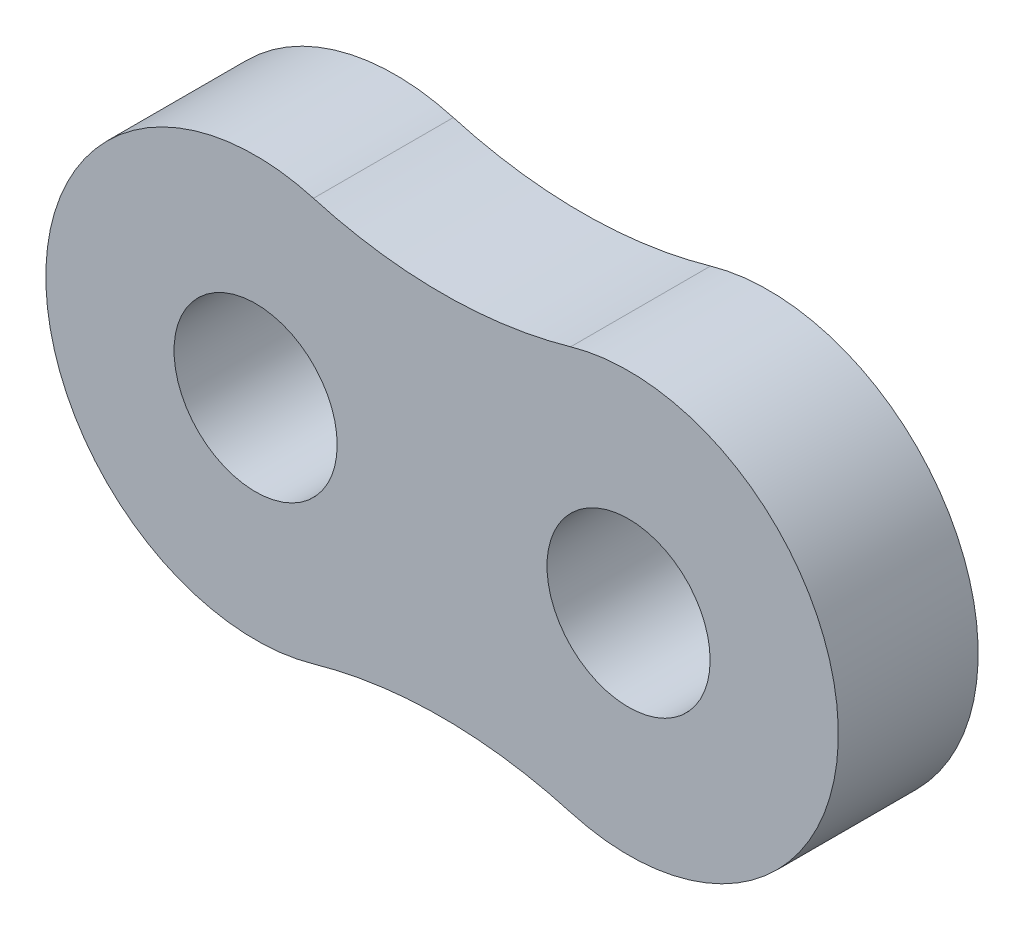
ISO-10303-21;
HEADER;
FILE_DESCRIPTION(('STEP AP214'),'2;1');
FILE_NAME('part.step','',(''),(''),'','','');
FILE_SCHEMA(('AUTOMOTIVE_DESIGN { 1 0 10303 214 1 1 1 1 }'));
ENDSEC;
DATA;
#1=APPLICATION_CONTEXT('core data for automotive mechanical design processes');
#2=APPLICATION_PROTOCOL_DEFINITION('international standard','automotive_design',2000,#1);
#3=PRODUCT_CONTEXT('',#1,'mechanical');
#4=PRODUCT('Part','Part','',(#3));
#5=PRODUCT_RELATED_PRODUCT_CATEGORY('part','',(#4));
#6=PRODUCT_DEFINITION_FORMATION('','',#4);
#7=PRODUCT_DEFINITION_CONTEXT('part definition',#1,'design');
#8=PRODUCT_DEFINITION('design','',#6,#7);
#9=PRODUCT_DEFINITION_SHAPE('','',#8);
#10=(LENGTH_UNIT() NAMED_UNIT(*) SI_UNIT(.MILLI.,.METRE.));
#11=(NAMED_UNIT(*) PLANE_ANGLE_UNIT() SI_UNIT($,.RADIAN.));
#12=(NAMED_UNIT(*) SI_UNIT($,.STERADIAN.) SOLID_ANGLE_UNIT());
#13=UNCERTAINTY_MEASURE_WITH_UNIT(LENGTH_MEASURE(1.E-05),#10,'distance_accuracy_value','');
#14=(GEOMETRIC_REPRESENTATION_CONTEXT(3) GLOBAL_UNCERTAINTY_ASSIGNED_CONTEXT((#13)) GLOBAL_UNIT_ASSIGNED_CONTEXT((#10,
#11,#12)) REPRESENTATION_CONTEXT('',''));
#15=CARTESIAN_POINT('',(0.,0.,0.));
#16=DIRECTION('',(0.,0.,1.));
#17=DIRECTION('',(1.,0.,0.));
#18=AXIS2_PLACEMENT_3D('',#15,#16,#17);
#19=CARTESIAN_POINT('',(0.,0.,3.));
#20=DIRECTION('',(0.,0.,-1.));
#21=DIRECTION('',(-1.,0.,0.));
#22=AXIS2_PLACEMENT_3D('',#19,#20,#21);
#23=CYLINDRICAL_SURFACE('',#22,4.5);
#24=CARTESIAN_POINT('',(0.,0.,0.));
#25=DIRECTION('',(0.,0.,1.));
#26=DIRECTION('',(1.,0.,0.));
#27=AXIS2_PLACEMENT_3D('',#24,#25,#26);
#28=CIRCLE('',#27,4.5);
#29=CARTESIAN_POINT('',(1.24137931034483,4.32538754423783,0.));
#30=VERTEX_POINT('',#29);
#31=CARTESIAN_POINT('',(1.24137931034483,-4.32538754423783,0.));
#32=VERTEX_POINT('',#31);
#33=EDGE_CURVE('E100',#30,#32,#28,.T.);
#34=ORIENTED_EDGE('',*,*,#33,.T.);
#35=DIRECTION('',(0.,0.,-1.));
#36=VECTOR('',#35,1.);
#37=CARTESIAN_POINT('',(1.24137931034483,-4.32538754423783,3.));
#38=LINE('',#37,#36);
#39=CARTESIAN_POINT('',(1.24137931034483,-4.32538754423783,3.));
#40=VERTEX_POINT('',#39);
#41=EDGE_CURVE('E52',#32,#40,#38,.F.);
#42=ORIENTED_EDGE('',*,*,#41,.T.);
#43=CARTESIAN_POINT('',(0.,0.,3.));
#44=DIRECTION('',(0.,0.,1.));
#45=DIRECTION('',(1.,0.,0.));
#46=AXIS2_PLACEMENT_3D('',#43,#44,#45);
#47=CIRCLE('',#46,4.5);
#48=CARTESIAN_POINT('',(1.24137931034483,4.32538754423783,3.));
#49=VERTEX_POINT('',#48);
#50=EDGE_CURVE('E116',#49,#40,#47,.T.);
#51=ORIENTED_EDGE('',*,*,#50,.F.);
#52=DIRECTION('',(0.,0.,-1.));
#53=VECTOR('',#52,1.);
#54=CARTESIAN_POINT('',(1.24137931034483,4.32538754423783,3.));
#55=LINE('',#54,#53);
#56=EDGE_CURVE('E94',#49,#30,#55,.T.);
#57=ORIENTED_EDGE('',*,*,#56,.T.);
#58=EDGE_LOOP('',(#34,#42,#51,#57));
#59=FACE_BOUND('',#58,.T.);
#60=ADVANCED_FACE('F37',(#59),#23,.T.);
#61=CARTESIAN_POINT('',(8.,0.,3.));
#62=DIRECTION('',(0.,0.,-1.));
#63=DIRECTION('',(-1.,0.,0.));
#64=AXIS2_PLACEMENT_3D('',#61,#62,#63);
#65=CYLINDRICAL_SURFACE('',#64,4.5);
#66=CARTESIAN_POINT('',(8.,0.,3.));
#67=DIRECTION('',(0.,0.,1.));
#68=DIRECTION('',(1.,0.,0.));
#69=AXIS2_PLACEMENT_3D('',#66,#67,#68);
#70=CIRCLE('',#69,4.5);
#71=CARTESIAN_POINT('',(6.75862068965517,-4.32538754423784,3.));
#72=VERTEX_POINT('',#71);
#73=CARTESIAN_POINT('',(6.75862068965517,4.32538754423784,3.));
#74=VERTEX_POINT('',#73);
#75=EDGE_CURVE('E93',#72,#74,#70,.T.);
#76=ORIENTED_EDGE('',*,*,#75,.F.);
#77=DIRECTION('',(0.,0.,-1.));
#78=VECTOR('',#77,1.);
#79=CARTESIAN_POINT('',(6.75862068965517,-4.32538754423783,3.));
#80=LINE('',#79,#78);
#81=CARTESIAN_POINT('',(6.75862068965517,-4.32538754423784,0.));
#82=VERTEX_POINT('',#81);
#83=EDGE_CURVE('E81',#72,#82,#80,.T.);
#84=ORIENTED_EDGE('',*,*,#83,.T.);
#85=CARTESIAN_POINT('',(8.,0.,0.));
#86=DIRECTION('',(0.,0.,1.));
#87=DIRECTION('',(1.,0.,0.));
#88=AXIS2_PLACEMENT_3D('',#85,#86,#87);
#89=CIRCLE('',#88,4.5);
#90=CARTESIAN_POINT('',(6.75862068965517,4.32538754423784,0.));
#91=VERTEX_POINT('',#90);
#92=EDGE_CURVE('E91',#82,#91,#89,.T.);
#93=ORIENTED_EDGE('',*,*,#92,.T.);
#94=DIRECTION('',(0.,0.,-1.));
#95=VECTOR('',#94,1.);
#96=CARTESIAN_POINT('',(6.75862068965517,4.32538754423784,3.));
#97=LINE('',#96,#95);
#98=EDGE_CURVE('E95',#91,#74,#97,.F.);
#99=ORIENTED_EDGE('',*,*,#98,.T.);
#100=EDGE_LOOP('',(#76,#84,#93,#99));
#101=FACE_BOUND('',#100,.T.);
#102=ADVANCED_FACE('F90',(#101),#65,.T.);
#103=CARTESIAN_POINT('',(8.,0.,3.));
#104=DIRECTION('',(0.,0.,-1.));
#105=DIRECTION('',(-1.,0.,0.));
#106=AXIS2_PLACEMENT_3D('',#103,#104,#105);
#107=CYLINDRICAL_SURFACE('',#106,1.75);
#108=CARTESIAN_POINT('',(8.,0.,3.));
#109=DIRECTION('',(0.,0.,1.));
#110=DIRECTION('',(1.,0.,0.));
#111=AXIS2_PLACEMENT_3D('',#108,#109,#110);
#112=CIRCLE('',#111,1.75);
#113=CARTESIAN_POINT('',(9.75,0.,3.));
#114=VERTEX_POINT('',#113);
#115=EDGE_CURVE('E103',#114,#114,#112,.T.);
#116=ORIENTED_EDGE('',*,*,#115,.T.);
#117=EDGE_LOOP('',(#116));
#118=FACE_BOUND('',#117,.T.);
#119=CARTESIAN_POINT('',(8.,0.,0.));
#120=DIRECTION('',(0.,0.,1.));
#121=DIRECTION('',(1.,0.,0.));
#122=AXIS2_PLACEMENT_3D('',#119,#120,#121);
#123=CIRCLE('',#122,1.75);
#124=CARTESIAN_POINT('',(9.75,0.,0.));
#125=VERTEX_POINT('',#124);
#126=EDGE_CURVE('E105',#125,#125,#123,.T.);
#127=ORIENTED_EDGE('',*,*,#126,.F.);
#128=EDGE_LOOP('',(#127));
#129=FACE_BOUND('',#128,.T.);
#130=ADVANCED_FACE('F128',(#118,#129),#107,.F.);
#131=CARTESIAN_POINT('',(0.,0.,3.));
#132=DIRECTION('',(0.,0.,-1.));
#133=DIRECTION('',(-1.,0.,0.));
#134=AXIS2_PLACEMENT_3D('',#131,#132,#133);
#135=CYLINDRICAL_SURFACE('',#134,1.75);
#136=CARTESIAN_POINT('',(0.,0.,3.));
#137=DIRECTION('',(0.,0.,1.));
#138=DIRECTION('',(1.,0.,0.));
#139=AXIS2_PLACEMENT_3D('',#136,#137,#138);
#140=CIRCLE('',#139,1.75);
#141=CARTESIAN_POINT('',(1.75,0.,3.));
#142=VERTEX_POINT('',#141);
#143=EDGE_CURVE('E109',#142,#142,#140,.T.);
#144=ORIENTED_EDGE('',*,*,#143,.T.);
#145=EDGE_LOOP('',(#144));
#146=FACE_BOUND('',#145,.T.);
#147=CARTESIAN_POINT('',(0.,0.,0.));
#148=DIRECTION('',(0.,0.,1.));
#149=DIRECTION('',(1.,0.,0.));
#150=AXIS2_PLACEMENT_3D('',#147,#148,#149);
#151=CIRCLE('',#150,1.75);
#152=CARTESIAN_POINT('',(1.75,0.,0.));
#153=VERTEX_POINT('',#152);
#154=EDGE_CURVE('E99',#153,#153,#151,.T.);
#155=ORIENTED_EDGE('',*,*,#154,.F.);
#156=EDGE_LOOP('',(#155));
#157=FACE_BOUND('',#156,.T.);
#158=ADVANCED_FACE('F130',(#146,#157),#135,.F.);
#159=CARTESIAN_POINT('',(0.,0.,3.));
#160=DIRECTION('',(0.,0.,1.));
#161=DIRECTION('',(1.,0.,0.));
#162=AXIS2_PLACEMENT_3D('',#159,#160,#161);
#163=PLANE('',#162);
#164=ORIENTED_EDGE('',*,*,#115,.F.);
#165=EDGE_LOOP('',(#164));
#166=FACE_BOUND('',#165,.T.);
#167=ORIENTED_EDGE('',*,*,#75,.T.);
#168=CARTESIAN_POINT('',(3.99999999999999,13.9373598647664,3.));
#169=DIRECTION('',(0.,0.,1.));
#170=DIRECTION('',(1.,0.,0.));
#171=AXIS2_PLACEMENT_3D('',#168,#169,#170);
#172=CIRCLE('',#171,10.);
#173=EDGE_CURVE('E11',#74,#49,#172,.F.);
#174=ORIENTED_EDGE('',*,*,#173,.T.);
#175=ORIENTED_EDGE('',*,*,#50,.T.);
#176=CARTESIAN_POINT('',(3.99999999999999,-13.9373598647664,3.));
#177=DIRECTION('',(0.,0.,1.));
#178=DIRECTION('',(1.,0.,0.));
#179=AXIS2_PLACEMENT_3D('',#176,#177,#178);
#180=CIRCLE('',#179,10.);
#181=EDGE_CURVE('E85',#40,#72,#180,.F.);
#182=ORIENTED_EDGE('',*,*,#181,.T.);
#183=EDGE_LOOP('',(#167,#174,#175,#182));
#184=FACE_BOUND('',#183,.T.);
#185=ORIENTED_EDGE('',*,*,#143,.F.);
#186=EDGE_LOOP('',(#185));
#187=FACE_BOUND('',#186,.T.);
#188=ADVANCED_FACE('F114',(#166,#184,#187),#163,.T.);
#189=CARTESIAN_POINT('',(0.,0.,0.));
#190=DIRECTION('',(0.,0.,1.));
#191=DIRECTION('',(1.,0.,0.));
#192=AXIS2_PLACEMENT_3D('',#189,#190,#191);
#193=PLANE('',#192);
#194=ORIENTED_EDGE('',*,*,#126,.T.);
#195=EDGE_LOOP('',(#194));
#196=FACE_BOUND('',#195,.T.);
#197=ORIENTED_EDGE('',*,*,#33,.F.);
#198=CARTESIAN_POINT('',(3.99999999999999,13.9373598647664,0.));
#199=DIRECTION('',(0.,0.,1.));
#200=DIRECTION('',(1.,0.,0.));
#201=AXIS2_PLACEMENT_3D('',#198,#199,#200);
#202=CIRCLE('',#201,10.);
#203=EDGE_CURVE('E45',#30,#91,#202,.T.);
#204=ORIENTED_EDGE('',*,*,#203,.T.);
#205=ORIENTED_EDGE('',*,*,#92,.F.);
#206=CARTESIAN_POINT('',(3.99999999999999,-13.9373598647664,0.));
#207=DIRECTION('',(0.,0.,1.));
#208=DIRECTION('',(1.,0.,0.));
#209=AXIS2_PLACEMENT_3D('',#206,#207,#208);
#210=CIRCLE('',#209,10.);
#211=EDGE_CURVE('E77',#82,#32,#210,.T.);
#212=ORIENTED_EDGE('',*,*,#211,.T.);
#213=EDGE_LOOP('',(#197,#204,#205,#212));
#214=FACE_BOUND('',#213,.T.);
#215=ORIENTED_EDGE('',*,*,#154,.T.);
#216=EDGE_LOOP('',(#215));
#217=FACE_BOUND('',#216,.T.);
#218=ADVANCED_FACE('F97',(#196,#214,#217),#193,.F.);
#219=CARTESIAN_POINT('',(3.99999999999999,-13.9373598647664,3.));
#220=DIRECTION('',(0.,0.,1.));
#221=DIRECTION('',(1.,0.,0.));
#222=AXIS2_PLACEMENT_3D('',#219,#220,#221);
#223=CYLINDRICAL_SURFACE('',#222,10.);
#224=ORIENTED_EDGE('',*,*,#181,.F.);
#225=ORIENTED_EDGE('',*,*,#41,.F.);
#226=ORIENTED_EDGE('',*,*,#211,.F.);
#227=ORIENTED_EDGE('',*,*,#83,.F.);
#228=EDGE_LOOP('',(#224,#225,#226,#227));
#229=FACE_BOUND('',#228,.T.);
#230=ADVANCED_FACE('F80',(#229),#223,.F.);
#231=CARTESIAN_POINT('',(3.99999999999999,13.9373598647664,3.));
#232=DIRECTION('',(0.,0.,1.));
#233=DIRECTION('',(1.,0.,0.));
#234=AXIS2_PLACEMENT_3D('',#231,#232,#233);
#235=CYLINDRICAL_SURFACE('',#234,10.);
#236=ORIENTED_EDGE('',*,*,#173,.F.);
#237=ORIENTED_EDGE('',*,*,#98,.F.);
#238=ORIENTED_EDGE('',*,*,#203,.F.);
#239=ORIENTED_EDGE('',*,*,#56,.F.);
#240=EDGE_LOOP('',(#236,#237,#238,#239));
#241=FACE_BOUND('',#240,.T.);
#242=ADVANCED_FACE('F39',(#241),#235,.F.);
#243=CLOSED_SHELL('',(#60,#102,#130,#158,#188,#218,#230,#242));
#244=MANIFOLD_SOLID_BREP('B2',#243);
#245=ADVANCED_BREP_SHAPE_REPRESENTATION('',(#18,#244),#14);
#246=SHAPE_DEFINITION_REPRESENTATION(#9,#245);
ENDSEC;
END-ISO-10303-21;
